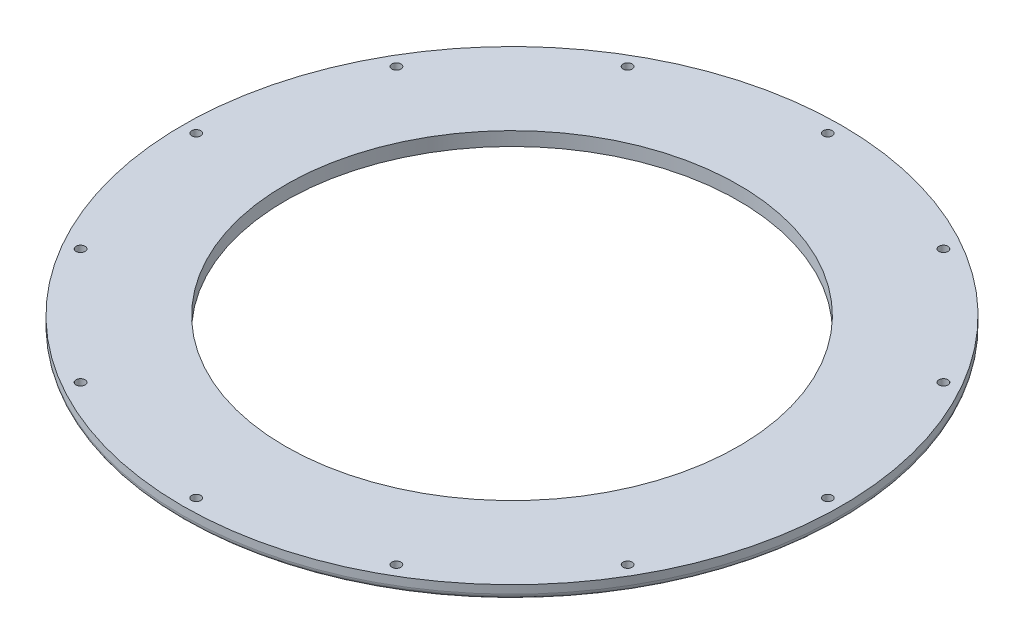
ISO-10303-21;
HEADER;
FILE_DESCRIPTION(('STEP AP214'),'2;1');
FILE_NAME('part.step','',(''),(''),'','','');
FILE_SCHEMA(('AUTOMOTIVE_DESIGN { 1 0 10303 214 1 1 1 1 }'));
ENDSEC;
DATA;
#1=APPLICATION_CONTEXT('core data for automotive mechanical design processes');
#2=APPLICATION_PROTOCOL_DEFINITION('international standard','automotive_design',2000,#1);
#3=PRODUCT_CONTEXT('',#1,'mechanical');
#4=PRODUCT('Part','Part','',(#3));
#5=PRODUCT_RELATED_PRODUCT_CATEGORY('part','',(#4));
#6=PRODUCT_DEFINITION_FORMATION('','',#4);
#7=PRODUCT_DEFINITION_CONTEXT('part definition',#1,'design');
#8=PRODUCT_DEFINITION('design','',#6,#7);
#9=PRODUCT_DEFINITION_SHAPE('','',#8);
#10=(LENGTH_UNIT() NAMED_UNIT(*) SI_UNIT(.MILLI.,.METRE.));
#11=(NAMED_UNIT(*) PLANE_ANGLE_UNIT() SI_UNIT($,.RADIAN.));
#12=(NAMED_UNIT(*) SI_UNIT($,.STERADIAN.) SOLID_ANGLE_UNIT());
#13=UNCERTAINTY_MEASURE_WITH_UNIT(LENGTH_MEASURE(1.E-05),#10,'distance_accuracy_value','');
#14=(GEOMETRIC_REPRESENTATION_CONTEXT(3) GLOBAL_UNCERTAINTY_ASSIGNED_CONTEXT((#13)) GLOBAL_UNIT_ASSIGNED_CONTEXT((#10,
#11,#12)) REPRESENTATION_CONTEXT('',''));
#15=CARTESIAN_POINT('',(0.,0.,0.));
#16=DIRECTION('',(0.,0.,1.));
#17=DIRECTION('',(1.,0.,0.));
#18=AXIS2_PLACEMENT_3D('',#15,#16,#17);
#19=CARTESIAN_POINT('',(0.,5.,0.));
#20=DIRECTION('',(0.,1.,0.));
#21=DIRECTION('',(0.,0.,1.));
#22=AXIS2_PLACEMENT_3D('',#19,#20,#21);
#23=PLANE('',#22);
#24=CARTESIAN_POINT('',(0.,5.,115.));
#25=DIRECTION('',(0.,1.,0.));
#26=DIRECTION('',(0.,0.,1.));
#27=AXIS2_PLACEMENT_3D('',#24,#25,#26);
#28=CIRCLE('',#27,1.65);
#29=CARTESIAN_POINT('',(0.,5.,116.65));
#30=VERTEX_POINT('',#29);
#31=EDGE_CURVE('E67',#30,#30,#28,.T.);
#32=ORIENTED_EDGE('',*,*,#31,.F.);
#33=EDGE_LOOP('',(#32));
#34=FACE_BOUND('',#33,.T.);
#35=CARTESIAN_POINT('',(-57.4999999999987,5.,99.5929214352112));
#36=DIRECTION('',(0.,1.,0.));
#37=DIRECTION('',(0.,0.,1.));
#38=AXIS2_PLACEMENT_3D('',#35,#36,#37);
#39=CIRCLE('',#38,1.65000000000001);
#40=CARTESIAN_POINT('',(-57.4999999999987,5.,101.242921435211));
#41=VERTEX_POINT('',#40);
#42=EDGE_CURVE('E72',#41,#41,#39,.T.);
#43=ORIENTED_EDGE('',*,*,#42,.F.);
#44=EDGE_LOOP('',(#43));
#45=FACE_BOUND('',#44,.T.);
#46=CARTESIAN_POINT('',(-99.5929214352098,5.,57.5000000000012));
#47=DIRECTION('',(0.,1.,0.));
#48=DIRECTION('',(0.,0.,1.));
#49=AXIS2_PLACEMENT_3D('',#46,#47,#48);
#50=CIRCLE('',#49,1.65);
#51=CARTESIAN_POINT('',(-99.5929214352098,5.,59.1500000000012));
#52=VERTEX_POINT('',#51);
#53=EDGE_CURVE('E74',#52,#52,#50,.T.);
#54=ORIENTED_EDGE('',*,*,#53,.F.);
#55=EDGE_LOOP('',(#54));
#56=FACE_BOUND('',#55,.T.);
#57=CARTESIAN_POINT('',(-115.,5.,1.20456106190088E-12));
#58=DIRECTION('',(0.,1.,0.));
#59=DIRECTION('',(0.,0.,1.));
#60=AXIS2_PLACEMENT_3D('',#57,#58,#59);
#61=CIRCLE('',#60,1.65);
#62=CARTESIAN_POINT('',(-115.,5.,1.6500000000012));
#63=VERTEX_POINT('',#62);
#64=EDGE_CURVE('E77',#63,#63,#61,.T.);
#65=ORIENTED_EDGE('',*,*,#64,.F.);
#66=EDGE_LOOP('',(#65));
#67=FACE_BOUND('',#66,.T.);
#68=CARTESIAN_POINT('',(57.5000000000001,5.,99.5929214352104));
#69=DIRECTION('',(0.,1.,0.));
#70=DIRECTION('',(0.,0.,1.));
#71=AXIS2_PLACEMENT_3D('',#68,#69,#70);
#72=CIRCLE('',#71,1.65000000000001);
#73=CARTESIAN_POINT('',(57.5000000000001,5.,101.24292143521));
#74=VERTEX_POINT('',#73);
#75=EDGE_CURVE('E80',#74,#74,#72,.T.);
#76=ORIENTED_EDGE('',*,*,#75,.F.);
#77=EDGE_LOOP('',(#76));
#78=FACE_BOUND('',#77,.T.);
#79=CARTESIAN_POINT('',(99.5929214352106,5.,57.4999999999998));
#80=DIRECTION('',(0.,1.,0.));
#81=DIRECTION('',(0.,0.,1.));
#82=AXIS2_PLACEMENT_3D('',#79,#80,#81);
#83=CIRCLE('',#82,1.64999999999999);
#84=CARTESIAN_POINT('',(99.5929214352106,5.,59.1499999999998));
#85=VERTEX_POINT('',#84);
#86=EDGE_CURVE('E85',#85,#85,#83,.T.);
#87=ORIENTED_EDGE('',*,*,#86,.F.);
#88=EDGE_LOOP('',(#87));
#89=FACE_BOUND('',#88,.T.);
#90=CARTESIAN_POINT('',(115.,5.,-4.0152035396696E-13));
#91=DIRECTION('',(0.,1.,0.));
#92=DIRECTION('',(0.,0.,1.));
#93=AXIS2_PLACEMENT_3D('',#90,#91,#92);
#94=CIRCLE('',#93,1.65);
#95=CARTESIAN_POINT('',(115.,5.,1.6499999999996));
#96=VERTEX_POINT('',#95);
#97=EDGE_CURVE('E88',#96,#96,#94,.T.);
#98=ORIENTED_EDGE('',*,*,#97,.F.);
#99=EDGE_LOOP('',(#98));
#100=FACE_BOUND('',#99,.T.);
#101=CARTESIAN_POINT('',(99.5929214352102,5.,-57.5000000000005));
#102=DIRECTION('',(0.,1.,0.));
#103=DIRECTION('',(0.,0.,1.));
#104=AXIS2_PLACEMENT_3D('',#101,#102,#103);
#105=CIRCLE('',#104,1.65);
#106=CARTESIAN_POINT('',(99.5929214352102,5.,-55.8500000000005));
#107=VERTEX_POINT('',#106);
#108=EDGE_CURVE('E90',#107,#107,#105,.T.);
#109=ORIENTED_EDGE('',*,*,#108,.F.);
#110=EDGE_LOOP('',(#109));
#111=FACE_BOUND('',#110,.T.);
#112=CARTESIAN_POINT('',(57.4999999999994,5.,-99.5929214352108));
#113=DIRECTION('',(0.,1.,0.));
#114=DIRECTION('',(0.,0.,1.));
#115=AXIS2_PLACEMENT_3D('',#112,#113,#114);
#116=CIRCLE('',#115,1.65);
#117=CARTESIAN_POINT('',(57.4999999999994,5.,-97.9429214352108));
#118=VERTEX_POINT('',#117);
#119=EDGE_CURVE('E95',#118,#118,#116,.T.);
#120=ORIENTED_EDGE('',*,*,#119,.F.);
#121=EDGE_LOOP('',(#120));
#122=FACE_BOUND('',#121,.T.);
#123=CARTESIAN_POINT('',(-8.03040707933921E-13,5.,-115.));
#124=DIRECTION('',(0.,1.,0.));
#125=DIRECTION('',(0.,0.,1.));
#126=AXIS2_PLACEMENT_3D('',#123,#124,#125);
#127=CIRCLE('',#126,1.65);
#128=CARTESIAN_POINT('',(-8.03040707933921E-13,5.,-113.35));
#129=VERTEX_POINT('',#128);
#130=EDGE_CURVE('E92',#129,#129,#127,.T.);
#131=ORIENTED_EDGE('',*,*,#130,.F.);
#132=EDGE_LOOP('',(#131));
#133=FACE_BOUND('',#132,.T.);
#134=CARTESIAN_POINT('',(-57.5000000000008,5.,-99.59292143521));
#135=DIRECTION('',(0.,1.,0.));
#136=DIRECTION('',(0.,0.,1.));
#137=AXIS2_PLACEMENT_3D('',#134,#135,#136);
#138=CIRCLE('',#137,1.65);
#139=CARTESIAN_POINT('',(-57.5000000000008,5.,-97.94292143521));
#140=VERTEX_POINT('',#139);
#141=EDGE_CURVE('E98',#140,#140,#138,.T.);
#142=ORIENTED_EDGE('',*,*,#141,.F.);
#143=EDGE_LOOP('',(#142));
#144=FACE_BOUND('',#143,.T.);
#145=CARTESIAN_POINT('',(-99.592921435211,5.,-57.4999999999991));
#146=DIRECTION('',(0.,1.,0.));
#147=DIRECTION('',(0.,0.,1.));
#148=AXIS2_PLACEMENT_3D('',#145,#146,#147);
#149=CIRCLE('',#148,1.65);
#150=CARTESIAN_POINT('',(-99.592921435211,5.,-55.8499999999991));
#151=VERTEX_POINT('',#150);
#152=EDGE_CURVE('E101',#151,#151,#149,.T.);
#153=ORIENTED_EDGE('',*,*,#152,.F.);
#154=EDGE_LOOP('',(#153));
#155=FACE_BOUND('',#154,.T.);
#156=CARTESIAN_POINT('',(0.,5.,0.));
#157=DIRECTION('',(0.,1.,0.));
#158=DIRECTION('',(0.,0.,1.));
#159=AXIS2_PLACEMENT_3D('',#156,#157,#158);
#160=CIRCLE('',#159,120.);
#161=CARTESIAN_POINT('',(0.,5.,120.));
#162=VERTEX_POINT('',#161);
#163=EDGE_CURVE('E57',#162,#162,#160,.T.);
#164=ORIENTED_EDGE('',*,*,#163,.T.);
#165=EDGE_LOOP('',(#164));
#166=FACE_BOUND('',#165,.T.);
#167=CARTESIAN_POINT('',(0.,5.,0.));
#168=DIRECTION('',(0.,1.,0.));
#169=DIRECTION('',(0.,0.,1.));
#170=AXIS2_PLACEMENT_3D('',#167,#168,#169);
#171=CIRCLE('',#170,82.5);
#172=CARTESIAN_POINT('',(0.,5.,82.5));
#173=VERTEX_POINT('',#172);
#174=EDGE_CURVE('E58',#173,#173,#171,.T.);
#175=ORIENTED_EDGE('',*,*,#174,.F.);
#176=EDGE_LOOP('',(#175));
#177=FACE_BOUND('',#176,.T.);
#178=ADVANCED_FACE('F44',(#34,#45,#56,#67,#78,#89,#100,#111,#122,#133,#144,#155,#166,#177),#23,.T.);
#179=CARTESIAN_POINT('',(0.,0.,0.));
#180=DIRECTION('',(0.,1.,0.));
#181=DIRECTION('',(0.,0.,1.));
#182=AXIS2_PLACEMENT_3D('',#179,#180,#181);
#183=PLANE('',#182);
#184=CARTESIAN_POINT('',(0.,0.,115.));
#185=DIRECTION('',(0.,-1.,0.));
#186=DIRECTION('',(0.,0.,-1.));
#187=AXIS2_PLACEMENT_3D('',#184,#185,#186);
#188=CIRCLE('',#187,1.65);
#189=CARTESIAN_POINT('',(0.,0.,113.35));
#190=VERTEX_POINT('',#189);
#191=EDGE_CURVE('E102',#190,#190,#188,.T.);
#192=ORIENTED_EDGE('',*,*,#191,.F.);
#193=EDGE_LOOP('',(#192));
#194=FACE_BOUND('',#193,.T.);
#195=CARTESIAN_POINT('',(-57.4999999999987,0.,99.5929214352112));
#196=DIRECTION('',(0.,-1.,0.));
#197=DIRECTION('',(0.,0.,-1.));
#198=AXIS2_PLACEMENT_3D('',#195,#196,#197);
#199=CIRCLE('',#198,1.65000000000001);
#200=CARTESIAN_POINT('',(-57.4999999999987,0.,97.9429214352112));
#201=VERTEX_POINT('',#200);
#202=EDGE_CURVE('E128',#201,#201,#199,.T.);
#203=ORIENTED_EDGE('',*,*,#202,.F.);
#204=EDGE_LOOP('',(#203));
#205=FACE_BOUND('',#204,.T.);
#206=CARTESIAN_POINT('',(-99.5929214352098,0.,57.5000000000012));
#207=DIRECTION('',(0.,-1.,0.));
#208=DIRECTION('',(0.,0.,-1.));
#209=AXIS2_PLACEMENT_3D('',#206,#207,#208);
#210=CIRCLE('',#209,1.65);
#211=CARTESIAN_POINT('',(-99.5929214352098,0.,55.8500000000012));
#212=VERTEX_POINT('',#211);
#213=EDGE_CURVE('E134',#212,#212,#210,.T.);
#214=ORIENTED_EDGE('',*,*,#213,.F.);
#215=EDGE_LOOP('',(#214));
#216=FACE_BOUND('',#215,.T.);
#217=CARTESIAN_POINT('',(-115.,0.,1.20456106190088E-12));
#218=DIRECTION('',(0.,-1.,0.));
#219=DIRECTION('',(0.,0.,-1.));
#220=AXIS2_PLACEMENT_3D('',#217,#218,#219);
#221=CIRCLE('',#220,1.65);
#222=CARTESIAN_POINT('',(-115.,0.,-1.6499999999988));
#223=VERTEX_POINT('',#222);
#224=EDGE_CURVE('E124',#223,#223,#221,.T.);
#225=ORIENTED_EDGE('',*,*,#224,.F.);
#226=EDGE_LOOP('',(#225));
#227=FACE_BOUND('',#226,.T.);
#228=CARTESIAN_POINT('',(57.5000000000001,0.,99.5929214352104));
#229=DIRECTION('',(0.,-1.,0.));
#230=DIRECTION('',(0.,0.,-1.));
#231=AXIS2_PLACEMENT_3D('',#228,#229,#230);
#232=CIRCLE('',#231,1.65000000000001);
#233=CARTESIAN_POINT('',(57.5000000000001,0.,97.9429214352104));
#234=VERTEX_POINT('',#233);
#235=EDGE_CURVE('E113',#234,#234,#232,.T.);
#236=ORIENTED_EDGE('',*,*,#235,.F.);
#237=EDGE_LOOP('',(#236));
#238=FACE_BOUND('',#237,.T.);
#239=CARTESIAN_POINT('',(99.5929214352106,0.,57.4999999999998));
#240=DIRECTION('',(0.,-1.,0.));
#241=DIRECTION('',(0.,0.,-1.));
#242=AXIS2_PLACEMENT_3D('',#239,#240,#241);
#243=CIRCLE('',#242,1.64999999999999);
#244=CARTESIAN_POINT('',(99.5929214352106,0.,55.8499999999998));
#245=VERTEX_POINT('',#244);
#246=EDGE_CURVE('E115',#245,#245,#243,.T.);
#247=ORIENTED_EDGE('',*,*,#246,.F.);
#248=EDGE_LOOP('',(#247));
#249=FACE_BOUND('',#248,.T.);
#250=CARTESIAN_POINT('',(115.,0.,-4.0152035396696E-13));
#251=DIRECTION('',(0.,-1.,0.));
#252=DIRECTION('',(0.,0.,-1.));
#253=AXIS2_PLACEMENT_3D('',#250,#251,#252);
#254=CIRCLE('',#253,1.65);
#255=CARTESIAN_POINT('',(115.,0.,-1.6500000000004));
#256=VERTEX_POINT('',#255);
#257=EDGE_CURVE('E107',#256,#256,#254,.T.);
#258=ORIENTED_EDGE('',*,*,#257,.F.);
#259=EDGE_LOOP('',(#258));
#260=FACE_BOUND('',#259,.T.);
#261=CARTESIAN_POINT('',(99.5929214352102,0.,-57.5000000000005));
#262=DIRECTION('',(0.,-1.,0.));
#263=DIRECTION('',(0.,0.,-1.));
#264=AXIS2_PLACEMENT_3D('',#261,#262,#263);
#265=CIRCLE('',#264,1.65);
#266=CARTESIAN_POINT('',(99.5929214352102,0.,-59.1500000000005));
#267=VERTEX_POINT('',#266);
#268=EDGE_CURVE('E104',#267,#267,#265,.T.);
#269=ORIENTED_EDGE('',*,*,#268,.F.);
#270=EDGE_LOOP('',(#269));
#271=FACE_BOUND('',#270,.T.);
#272=CARTESIAN_POINT('',(57.4999999999994,0.,-99.5929214352108));
#273=DIRECTION('',(0.,-1.,0.));
#274=DIRECTION('',(0.,0.,-1.));
#275=AXIS2_PLACEMENT_3D('',#272,#273,#274);
#276=CIRCLE('',#275,1.65);
#277=CARTESIAN_POINT('',(57.4999999999994,0.,-101.242921435211));
#278=VERTEX_POINT('',#277);
#279=EDGE_CURVE('E108',#278,#278,#276,.T.);
#280=ORIENTED_EDGE('',*,*,#279,.F.);
#281=EDGE_LOOP('',(#280));
#282=FACE_BOUND('',#281,.T.);
#283=CARTESIAN_POINT('',(-8.03040707933921E-13,0.,-115.));
#284=DIRECTION('',(0.,-1.,0.));
#285=DIRECTION('',(0.,0.,-1.));
#286=AXIS2_PLACEMENT_3D('',#283,#284,#285);
#287=CIRCLE('',#286,1.65);
#288=CARTESIAN_POINT('',(-8.03040707933921E-13,0.,-116.65));
#289=VERTEX_POINT('',#288);
#290=EDGE_CURVE('E123',#289,#289,#287,.T.);
#291=ORIENTED_EDGE('',*,*,#290,.F.);
#292=EDGE_LOOP('',(#291));
#293=FACE_BOUND('',#292,.T.);
#294=CARTESIAN_POINT('',(-57.5000000000008,0.,-99.59292143521));
#295=DIRECTION('',(0.,-1.,0.));
#296=DIRECTION('',(0.,0.,-1.));
#297=AXIS2_PLACEMENT_3D('',#294,#295,#296);
#298=CIRCLE('',#297,1.65);
#299=CARTESIAN_POINT('',(-57.5000000000008,0.,-101.24292143521));
#300=VERTEX_POINT('',#299);
#301=EDGE_CURVE('E122',#300,#300,#298,.T.);
#302=ORIENTED_EDGE('',*,*,#301,.F.);
#303=EDGE_LOOP('',(#302));
#304=FACE_BOUND('',#303,.T.);
#305=CARTESIAN_POINT('',(-99.592921435211,0.,-57.4999999999991));
#306=DIRECTION('',(0.,-1.,0.));
#307=DIRECTION('',(0.,0.,-1.));
#308=AXIS2_PLACEMENT_3D('',#305,#306,#307);
#309=CIRCLE('',#308,1.65);
#310=CARTESIAN_POINT('',(-99.592921435211,0.,-59.1499999999991));
#311=VERTEX_POINT('',#310);
#312=EDGE_CURVE('E119',#311,#311,#309,.T.);
#313=ORIENTED_EDGE('',*,*,#312,.F.);
#314=EDGE_LOOP('',(#313));
#315=FACE_BOUND('',#314,.T.);
#316=CARTESIAN_POINT('',(0.,0.,0.));
#317=DIRECTION('',(0.,1.,0.));
#318=DIRECTION('',(0.,0.,1.));
#319=AXIS2_PLACEMENT_3D('',#316,#317,#318);
#320=CIRCLE('',#319,118.);
#321=CARTESIAN_POINT('',(0.,0.,118.));
#322=VERTEX_POINT('',#321);
#323=EDGE_CURVE('E10',#322,#322,#320,.F.);
#324=ORIENTED_EDGE('',*,*,#323,.T.);
#325=EDGE_LOOP('',(#324));
#326=FACE_BOUND('',#325,.T.);
#327=CARTESIAN_POINT('',(0.,0.,0.));
#328=DIRECTION('',(0.,1.,0.));
#329=DIRECTION('',(0.,0.,1.));
#330=AXIS2_PLACEMENT_3D('',#327,#328,#329);
#331=CIRCLE('',#330,82.5);
#332=CARTESIAN_POINT('',(0.,0.,82.5));
#333=VERTEX_POINT('',#332);
#334=EDGE_CURVE('E64',#333,#333,#331,.T.);
#335=ORIENTED_EDGE('',*,*,#334,.T.);
#336=EDGE_LOOP('',(#335));
#337=FACE_BOUND('',#336,.T.);
#338=ADVANCED_FACE('F141',(#194,#205,#216,#227,#238,#249,#260,#271,#282,#293,#304,#315,#326,
#337),#183,.F.);
#339=CARTESIAN_POINT('',(0.,5.,0.));
#340=DIRECTION('',(0.,-1.,0.));
#341=DIRECTION('',(0.,0.,-1.));
#342=AXIS2_PLACEMENT_3D('',#339,#340,#341);
#343=CYLINDRICAL_SURFACE('',#342,120.);
#344=CARTESIAN_POINT('',(0.,2.,0.));
#345=DIRECTION('',(0.,1.,0.));
#346=DIRECTION('',(0.,0.,1.));
#347=AXIS2_PLACEMENT_3D('',#344,#345,#346);
#348=CIRCLE('',#347,120.);
#349=CARTESIAN_POINT('',(0.,2.,120.));
#350=VERTEX_POINT('',#349);
#351=EDGE_CURVE('E55',#350,#350,#348,.T.);
#352=ORIENTED_EDGE('',*,*,#351,.T.);
#353=EDGE_LOOP('',(#352));
#354=FACE_BOUND('',#353,.T.);
#355=ORIENTED_EDGE('',*,*,#163,.F.);
#356=EDGE_LOOP('',(#355));
#357=FACE_BOUND('',#356,.T.);
#358=ADVANCED_FACE('F148',(#354,#357),#343,.T.);
#359=CARTESIAN_POINT('',(0.,5.,0.));
#360=DIRECTION('',(0.,-1.,0.));
#361=DIRECTION('',(0.,0.,-1.));
#362=AXIS2_PLACEMENT_3D('',#359,#360,#361);
#363=CYLINDRICAL_SURFACE('',#362,82.5);
#364=ORIENTED_EDGE('',*,*,#174,.T.);
#365=EDGE_LOOP('',(#364));
#366=FACE_BOUND('',#365,.T.);
#367=ORIENTED_EDGE('',*,*,#334,.F.);
#368=EDGE_LOOP('',(#367));
#369=FACE_BOUND('',#368,.T.);
#370=ADVANCED_FACE('F172',(#366,#369),#363,.F.);
#371=CARTESIAN_POINT('',(0.,2.,0.));
#372=DIRECTION('',(0.,1.,0.));
#373=DIRECTION('',(0.,0.,1.));
#374=AXIS2_PLACEMENT_3D('',#371,#372,#373);
#375=TOROIDAL_SURFACE('',#374,118.,2.);
#376=ORIENTED_EDGE('',*,*,#323,.F.);
#377=EDGE_LOOP('',(#376));
#378=FACE_BOUND('',#377,.T.);
#379=ORIENTED_EDGE('',*,*,#351,.F.);
#380=EDGE_LOOP('',(#379));
#381=FACE_BOUND('',#380,.T.);
#382=ADVANCED_FACE('F50',(#378,#381),#375,.T.);
#383=CARTESIAN_POINT('',(-99.592921435211,8.,-57.4999999999991));
#384=DIRECTION('',(0.,-1.,0.));
#385=DIRECTION('',(0.,0.,-1.));
#386=AXIS2_PLACEMENT_3D('',#383,#384,#385);
#387=CYLINDRICAL_SURFACE('',#386,1.65);
#388=ORIENTED_EDGE('',*,*,#152,.T.);
#389=EDGE_LOOP('',(#388));
#390=FACE_BOUND('',#389,.T.);
#391=ORIENTED_EDGE('',*,*,#312,.T.);
#392=EDGE_LOOP('',(#391));
#393=FACE_BOUND('',#392,.T.);
#394=ADVANCED_FACE('F178',(#390,#393),#387,.F.);
#395=CARTESIAN_POINT('',(-57.5000000000008,8.,-99.59292143521));
#396=DIRECTION('',(0.,-1.,0.));
#397=DIRECTION('',(0.,0.,-1.));
#398=AXIS2_PLACEMENT_3D('',#395,#396,#397);
#399=CYLINDRICAL_SURFACE('',#398,1.65);
#400=ORIENTED_EDGE('',*,*,#141,.T.);
#401=EDGE_LOOP('',(#400));
#402=FACE_BOUND('',#401,.T.);
#403=ORIENTED_EDGE('',*,*,#301,.T.);
#404=EDGE_LOOP('',(#403));
#405=FACE_BOUND('',#404,.T.);
#406=ADVANCED_FACE('F218',(#402,#405),#399,.F.);
#407=CARTESIAN_POINT('',(-8.03040707933921E-13,8.,-115.));
#408=DIRECTION('',(0.,-1.,0.));
#409=DIRECTION('',(0.,0.,-1.));
#410=AXIS2_PLACEMENT_3D('',#407,#408,#409);
#411=CYLINDRICAL_SURFACE('',#410,1.65);
#412=ORIENTED_EDGE('',*,*,#130,.T.);
#413=EDGE_LOOP('',(#412));
#414=FACE_BOUND('',#413,.T.);
#415=ORIENTED_EDGE('',*,*,#290,.T.);
#416=EDGE_LOOP('',(#415));
#417=FACE_BOUND('',#416,.T.);
#418=ADVANCED_FACE('F221',(#414,#417),#411,.F.);
#419=CARTESIAN_POINT('',(57.4999999999994,8.,-99.5929214352108));
#420=DIRECTION('',(0.,-1.,0.));
#421=DIRECTION('',(0.,0.,-1.));
#422=AXIS2_PLACEMENT_3D('',#419,#420,#421);
#423=CYLINDRICAL_SURFACE('',#422,1.65);
#424=ORIENTED_EDGE('',*,*,#119,.T.);
#425=EDGE_LOOP('',(#424));
#426=FACE_BOUND('',#425,.T.);
#427=ORIENTED_EDGE('',*,*,#279,.T.);
#428=EDGE_LOOP('',(#427));
#429=FACE_BOUND('',#428,.T.);
#430=ADVANCED_FACE('F244',(#426,#429),#423,.F.);
#431=CARTESIAN_POINT('',(99.5929214352102,8.,-57.5000000000005));
#432=DIRECTION('',(0.,-1.,0.));
#433=DIRECTION('',(0.,0.,-1.));
#434=AXIS2_PLACEMENT_3D('',#431,#432,#433);
#435=CYLINDRICAL_SURFACE('',#434,1.65);
#436=ORIENTED_EDGE('',*,*,#108,.T.);
#437=EDGE_LOOP('',(#436));
#438=FACE_BOUND('',#437,.T.);
#439=ORIENTED_EDGE('',*,*,#268,.T.);
#440=EDGE_LOOP('',(#439));
#441=FACE_BOUND('',#440,.T.);
#442=ADVANCED_FACE('F238',(#438,#441),#435,.F.);
#443=CARTESIAN_POINT('',(115.,8.,-4.0152035396696E-13));
#444=DIRECTION('',(0.,-1.,0.));
#445=DIRECTION('',(0.,0.,-1.));
#446=AXIS2_PLACEMENT_3D('',#443,#444,#445);
#447=CYLINDRICAL_SURFACE('',#446,1.65);
#448=ORIENTED_EDGE('',*,*,#97,.T.);
#449=EDGE_LOOP('',(#448));
#450=FACE_BOUND('',#449,.T.);
#451=ORIENTED_EDGE('',*,*,#257,.T.);
#452=EDGE_LOOP('',(#451));
#453=FACE_BOUND('',#452,.T.);
#454=ADVANCED_FACE('F240',(#450,#453),#447,.F.);
#455=CARTESIAN_POINT('',(99.5929214352106,8.,57.4999999999998));
#456=DIRECTION('',(0.,-1.,0.));
#457=DIRECTION('',(0.,0.,-1.));
#458=AXIS2_PLACEMENT_3D('',#455,#456,#457);
#459=CYLINDRICAL_SURFACE('',#458,1.64999999999999);
#460=ORIENTED_EDGE('',*,*,#86,.T.);
#461=EDGE_LOOP('',(#460));
#462=FACE_BOUND('',#461,.T.);
#463=ORIENTED_EDGE('',*,*,#246,.T.);
#464=EDGE_LOOP('',(#463));
#465=FACE_BOUND('',#464,.T.);
#466=ADVANCED_FACE('F235',(#462,#465),#459,.F.);
#467=CARTESIAN_POINT('',(57.5000000000001,8.,99.5929214352104));
#468=DIRECTION('',(0.,-1.,0.));
#469=DIRECTION('',(0.,0.,-1.));
#470=AXIS2_PLACEMENT_3D('',#467,#468,#469);
#471=CYLINDRICAL_SURFACE('',#470,1.65000000000001);
#472=ORIENTED_EDGE('',*,*,#75,.T.);
#473=EDGE_LOOP('',(#472));
#474=FACE_BOUND('',#473,.T.);
#475=ORIENTED_EDGE('',*,*,#235,.T.);
#476=EDGE_LOOP('',(#475));
#477=FACE_BOUND('',#476,.T.);
#478=ADVANCED_FACE('F228',(#474,#477),#471,.F.);
#479=CARTESIAN_POINT('',(-115.,8.,1.20456106190088E-12));
#480=DIRECTION('',(0.,-1.,0.));
#481=DIRECTION('',(0.,0.,-1.));
#482=AXIS2_PLACEMENT_3D('',#479,#480,#481);
#483=CYLINDRICAL_SURFACE('',#482,1.65);
#484=ORIENTED_EDGE('',*,*,#64,.T.);
#485=EDGE_LOOP('',(#484));
#486=FACE_BOUND('',#485,.T.);
#487=ORIENTED_EDGE('',*,*,#224,.T.);
#488=EDGE_LOOP('',(#487));
#489=FACE_BOUND('',#488,.T.);
#490=ADVANCED_FACE('F234',(#486,#489),#483,.F.);
#491=CARTESIAN_POINT('',(-99.5929214352098,8.,57.5000000000012));
#492=DIRECTION('',(0.,-1.,0.));
#493=DIRECTION('',(0.,0.,-1.));
#494=AXIS2_PLACEMENT_3D('',#491,#492,#493);
#495=CYLINDRICAL_SURFACE('',#494,1.65);
#496=ORIENTED_EDGE('',*,*,#53,.T.);
#497=EDGE_LOOP('',(#496));
#498=FACE_BOUND('',#497,.T.);
#499=ORIENTED_EDGE('',*,*,#213,.T.);
#500=EDGE_LOOP('',(#499));
#501=FACE_BOUND('',#500,.T.);
#502=ADVANCED_FACE('F257',(#498,#501),#495,.F.);
#503=CARTESIAN_POINT('',(-57.4999999999987,8.,99.5929214352112));
#504=DIRECTION('',(0.,-1.,0.));
#505=DIRECTION('',(0.,0.,-1.));
#506=AXIS2_PLACEMENT_3D('',#503,#504,#505);
#507=CYLINDRICAL_SURFACE('',#506,1.65000000000001);
#508=ORIENTED_EDGE('',*,*,#42,.T.);
#509=EDGE_LOOP('',(#508));
#510=FACE_BOUND('',#509,.T.);
#511=ORIENTED_EDGE('',*,*,#202,.T.);
#512=EDGE_LOOP('',(#511));
#513=FACE_BOUND('',#512,.T.);
#514=ADVANCED_FACE('F260',(#510,#513),#507,.F.);
#515=CARTESIAN_POINT('',(0.,8.,115.));
#516=DIRECTION('',(0.,-1.,0.));
#517=DIRECTION('',(0.,0.,-1.));
#518=AXIS2_PLACEMENT_3D('',#515,#516,#517);
#519=CYLINDRICAL_SURFACE('',#518,1.65);
#520=ORIENTED_EDGE('',*,*,#31,.T.);
#521=EDGE_LOOP('',(#520));
#522=FACE_BOUND('',#521,.T.);
#523=ORIENTED_EDGE('',*,*,#191,.T.);
#524=EDGE_LOOP('',(#523));
#525=FACE_BOUND('',#524,.T.);
#526=ADVANCED_FACE('F143',(#522,#525),#519,.F.);
#527=CLOSED_SHELL('',(#178,#338,#358,#370,#382,#394,#406,#418,#430,#442,#454,#466,#478,#490,
#502,#514,#526));
#528=MANIFOLD_SOLID_BREP('B2',#527);
#529=ADVANCED_BREP_SHAPE_REPRESENTATION('',(#18,#528),#14);
#530=SHAPE_DEFINITION_REPRESENTATION(#9,#529);
ENDSEC;
END-ISO-10303-21;
